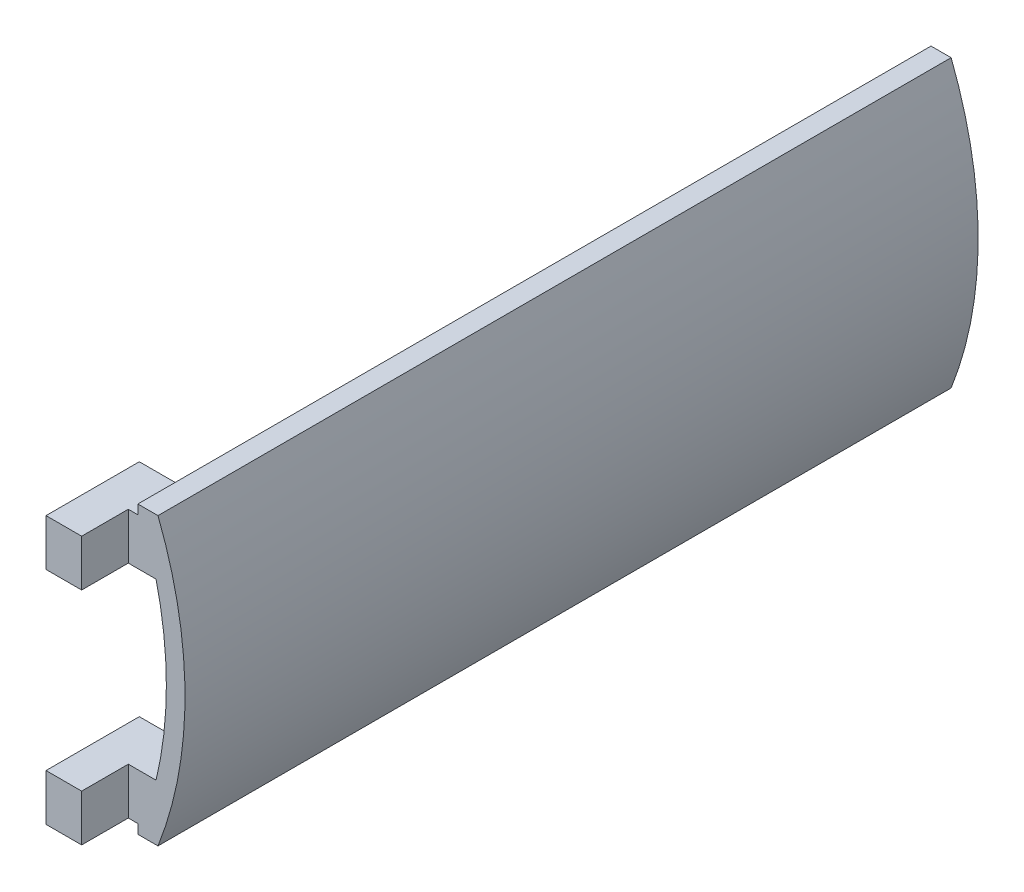
ISO-10303-21;
HEADER;
FILE_DESCRIPTION(('STEP AP214'),'2;1');
FILE_NAME('part.step','',(''),(''),'','','');
FILE_SCHEMA(('AUTOMOTIVE_DESIGN { 1 0 10303 214 1 1 1 1 }'));
ENDSEC;
DATA;
#1=APPLICATION_CONTEXT('core data for automotive mechanical design processes');
#2=APPLICATION_PROTOCOL_DEFINITION('international standard','automotive_design',2000,#1);
#3=PRODUCT_CONTEXT('',#1,'mechanical');
#4=PRODUCT('Part','Part','',(#3));
#5=PRODUCT_RELATED_PRODUCT_CATEGORY('part','',(#4));
#6=PRODUCT_DEFINITION_FORMATION('','',#4);
#7=PRODUCT_DEFINITION_CONTEXT('part definition',#1,'design');
#8=PRODUCT_DEFINITION('design','',#6,#7);
#9=PRODUCT_DEFINITION_SHAPE('','',#8);
#10=(LENGTH_UNIT() NAMED_UNIT(*) SI_UNIT(.MILLI.,.METRE.));
#11=(NAMED_UNIT(*) PLANE_ANGLE_UNIT() SI_UNIT($,.RADIAN.));
#12=(NAMED_UNIT(*) SI_UNIT($,.STERADIAN.) SOLID_ANGLE_UNIT());
#13=UNCERTAINTY_MEASURE_WITH_UNIT(LENGTH_MEASURE(1.E-05),#10,'distance_accuracy_value','');
#14=(GEOMETRIC_REPRESENTATION_CONTEXT(3) GLOBAL_UNCERTAINTY_ASSIGNED_CONTEXT((#13)) GLOBAL_UNIT_ASSIGNED_CONTEXT((#10,
#11,#12)) REPRESENTATION_CONTEXT('',''));
#15=CARTESIAN_POINT('',(0.,0.,0.));
#16=DIRECTION('',(0.,0.,1.));
#17=DIRECTION('',(1.,0.,0.));
#18=AXIS2_PLACEMENT_3D('',#15,#16,#17);
#19=CARTESIAN_POINT('',(0.,0.,85.));
#20=DIRECTION('',(0.,0.,1.));
#21=DIRECTION('',(1.,0.,0.));
#22=AXIS2_PLACEMENT_3D('',#19,#20,#21);
#23=PLANE('',#22);
#24=DIRECTION('',(-1.,0.,0.));
#25=VECTOR('',#24,1.);
#26=CARTESIAN_POINT('',(38.8967416970991,-9.32970982127268,85.));
#27=LINE('',#26,#25);
#28=CARTESIAN_POINT('',(38.8967416970991,-9.32970982127269,85.));
#29=VERTEX_POINT('',#28);
#30=CARTESIAN_POINT('',(35.9228767379871,-9.32970982127269,85.));
#31=VERTEX_POINT('',#30);
#32=EDGE_CURVE('E50',#29,#31,#27,.T.);
#33=ORIENTED_EDGE('',*,*,#32,.T.);
#34=DIRECTION('',(0.,1.,0.));
#35=VECTOR('',#34,1.);
#36=CARTESIAN_POINT('',(35.9228767379871,-9.32970982127269,85.));
#37=LINE('',#36,#35);
#38=CARTESIAN_POINT('',(35.9228767379871,-14.3297098212727,85.));
#39=VERTEX_POINT('',#38);
#40=EDGE_CURVE('E182',#39,#31,#37,.T.);
#41=ORIENTED_EDGE('',*,*,#40,.F.);
#42=DIRECTION('',(1.,0.,0.));
#43=VECTOR('',#42,1.);
#44=CARTESIAN_POINT('',(32.1024295510596,-14.3297098212727,85.));
#45=LINE('',#44,#43);
#46=CARTESIAN_POINT('',(36.9459063604559,-14.3297098212727,85.));
#47=VERTEX_POINT('',#46);
#48=EDGE_CURVE('E192',#39,#47,#45,.T.);
#49=ORIENTED_EDGE('',*,*,#48,.T.);
#50=DIRECTION('',(0.,-1.,0.));
#51=VECTOR('',#50,1.);
#52=CARTESIAN_POINT('',(36.9459063604559,-14.3297098212727,85.));
#53=LINE('',#52,#51);
#54=CARTESIAN_POINT('',(36.9459063604559,-15.3297098212727,85.));
#55=VERTEX_POINT('',#54);
#56=EDGE_CURVE('E203',#47,#55,#53,.T.);
#57=ORIENTED_EDGE('',*,*,#56,.T.);
#58=DIRECTION('',(-1.,0.,0.));
#59=VECTOR('',#58,1.);
#60=CARTESIAN_POINT('',(39.1024295510596,-15.3297098212727,85.));
#61=LINE('',#60,#59);
#62=CARTESIAN_POINT('',(39.1024295510596,-15.3297098212727,85.));
#63=VERTEX_POINT('',#62);
#64=EDGE_CURVE('E278',#63,#55,#61,.T.);
#65=ORIENTED_EDGE('',*,*,#64,.F.);
#66=CARTESIAN_POINT('',(0.,0.,85.));
#67=DIRECTION('',(0.,0.,-1.));
#68=DIRECTION('',(-1.,0.,0.));
#69=AXIS2_PLACEMENT_3D('',#66,#67,#68);
#70=CIRCLE('',#69,42.);
#71=CARTESIAN_POINT('',(39.1024295510596,15.3297098212727,85.));
#72=VERTEX_POINT('',#71);
#73=EDGE_CURVE('E275',#72,#63,#70,.T.);
#74=ORIENTED_EDGE('',*,*,#73,.F.);
#75=DIRECTION('',(1.,0.,0.));
#76=VECTOR('',#75,1.);
#77=CARTESIAN_POINT('',(36.9459063604559,15.3297098212727,85.));
#78=LINE('',#77,#76);
#79=CARTESIAN_POINT('',(36.9459063604559,15.3297098212727,85.));
#80=VERTEX_POINT('',#79);
#81=EDGE_CURVE('E271',#80,#72,#78,.T.);
#82=ORIENTED_EDGE('',*,*,#81,.F.);
#83=DIRECTION('',(0.,-1.,0.));
#84=VECTOR('',#83,1.);
#85=CARTESIAN_POINT('',(36.9459063604559,15.3297098212727,85.));
#86=LINE('',#85,#84);
#87=CARTESIAN_POINT('',(36.9459063604559,14.3297098212727,85.));
#88=VERTEX_POINT('',#87);
#89=EDGE_CURVE('E241',#80,#88,#86,.T.);
#90=ORIENTED_EDGE('',*,*,#89,.T.);
#91=DIRECTION('',(-1.,0.,0.));
#92=VECTOR('',#91,1.);
#93=CARTESIAN_POINT('',(36.9459063604559,14.3297098212727,85.));
#94=LINE('',#93,#92);
#95=CARTESIAN_POINT('',(35.9228767379871,14.3297098212727,85.));
#96=VERTEX_POINT('',#95);
#97=EDGE_CURVE('E246',#88,#96,#94,.T.);
#98=ORIENTED_EDGE('',*,*,#97,.T.);
#99=DIRECTION('',(0.,1.,0.));
#100=VECTOR('',#99,1.);
#101=CARTESIAN_POINT('',(35.9228767379871,14.3297098212727,85.));
#102=LINE('',#101,#100);
#103=CARTESIAN_POINT('',(35.9228767379871,9.32970982127266,85.));
#104=VERTEX_POINT('',#103);
#105=EDGE_CURVE('E209',#104,#96,#102,.T.);
#106=ORIENTED_EDGE('',*,*,#105,.F.);
#107=DIRECTION('',(1.,0.,0.));
#108=VECTOR('',#107,1.);
#109=CARTESIAN_POINT('',(32.1024295510596,9.32970982127266,85.));
#110=LINE('',#109,#108);
#111=CARTESIAN_POINT('',(38.8967416970991,9.32970982127267,85.));
#112=VERTEX_POINT('',#111);
#113=EDGE_CURVE('E249',#104,#112,#110,.T.);
#114=ORIENTED_EDGE('',*,*,#113,.T.);
#115=CARTESIAN_POINT('',(0.,0.,85.));
#116=DIRECTION('',(0.,0.,1.));
#117=DIRECTION('',(1.,0.,0.));
#118=AXIS2_PLACEMENT_3D('',#115,#116,#117);
#119=CIRCLE('',#118,40.);
#120=EDGE_CURVE('E269',#29,#112,#119,.T.);
#121=ORIENTED_EDGE('',*,*,#120,.F.);
#122=EDGE_LOOP('',(#33,#41,#49,#57,#65,#74,#82,#90,#98,#106,#114,#121));
#123=FACE_BOUND('',#122,.T.);
#124=ADVANCED_FACE('F33',(#123),#23,.T.);
#125=CARTESIAN_POINT('',(0.,0.,85.));
#126=DIRECTION('',(0.,0.,-1.));
#127=DIRECTION('',(-1.,0.,0.));
#128=AXIS2_PLACEMENT_3D('',#125,#126,#127);
#129=CYLINDRICAL_SURFACE('',#128,40.);
#130=DIRECTION('',(0.,0.,1.));
#131=VECTOR('',#130,1.);
#132=CARTESIAN_POINT('',(38.8967416970991,-9.32970982127269,80.));
#133=LINE('',#132,#131);
#134=CARTESIAN_POINT('',(38.8967416970991,-9.32970982127268,80.));
#135=VERTEX_POINT('',#134);
#136=EDGE_CURVE('E210',#135,#29,#133,.T.);
#137=ORIENTED_EDGE('',*,*,#136,.T.);
#138=ORIENTED_EDGE('',*,*,#120,.T.);
#139=DIRECTION('',(0.,0.,1.));
#140=VECTOR('',#139,1.);
#141=CARTESIAN_POINT('',(38.8967416970991,9.32970982127267,80.));
#142=LINE('',#141,#140);
#143=CARTESIAN_POINT('',(38.8967416970991,9.32970982127267,80.));
#144=VERTEX_POINT('',#143);
#145=EDGE_CURVE('E258',#144,#112,#142,.T.);
#146=ORIENTED_EDGE('',*,*,#145,.F.);
#147=CARTESIAN_POINT('',(0.,0.,80.));
#148=DIRECTION('',(0.,0.,1.));
#149=DIRECTION('',(1.,0.,0.));
#150=AXIS2_PLACEMENT_3D('',#147,#148,#149);
#151=CIRCLE('',#150,40.);
#152=CARTESIAN_POINT('',(36.9459063604559,15.3297098212727,80.));
#153=VERTEX_POINT('',#152);
#154=EDGE_CURVE('E228',#144,#153,#151,.T.);
#155=ORIENTED_EDGE('',*,*,#154,.T.);
#156=DIRECTION('',(0.,0.,-1.));
#157=VECTOR('',#156,1.);
#158=CARTESIAN_POINT('',(36.9459063604559,15.3297098212727,85.));
#159=LINE('',#158,#157);
#160=CARTESIAN_POINT('',(36.9459063604559,15.3297098212727,0.));
#161=VERTEX_POINT('',#160);
#162=EDGE_CURVE('E280',#153,#161,#159,.T.);
#163=ORIENTED_EDGE('',*,*,#162,.T.);
#164=CARTESIAN_POINT('',(0.,0.,0.));
#165=DIRECTION('',(0.,0.,1.));
#166=DIRECTION('',(1.,0.,0.));
#167=AXIS2_PLACEMENT_3D('',#164,#165,#166);
#168=CIRCLE('',#167,40.);
#169=CARTESIAN_POINT('',(36.9459063604559,-15.3297098212727,0.));
#170=VERTEX_POINT('',#169);
#171=EDGE_CURVE('E261',#170,#161,#168,.T.);
#172=ORIENTED_EDGE('',*,*,#171,.F.);
#173=DIRECTION('',(0.,0.,-1.));
#174=VECTOR('',#173,1.);
#175=CARTESIAN_POINT('',(36.9459063604559,-15.3297098212727,85.));
#176=LINE('',#175,#174);
#177=CARTESIAN_POINT('',(36.9459063604559,-15.3297098212727,80.));
#178=VERTEX_POINT('',#177);
#179=EDGE_CURVE('E42',#178,#170,#176,.T.);
#180=ORIENTED_EDGE('',*,*,#179,.F.);
#181=CARTESIAN_POINT('',(0.,0.,80.));
#182=DIRECTION('',(0.,0.,1.));
#183=DIRECTION('',(1.,0.,0.));
#184=AXIS2_PLACEMENT_3D('',#181,#182,#183);
#185=CIRCLE('',#184,40.);
#186=EDGE_CURVE('E58',#178,#135,#185,.T.);
#187=ORIENTED_EDGE('',*,*,#186,.T.);
#188=EDGE_LOOP('',(#137,#138,#146,#155,#163,#172,#180,#187));
#189=FACE_BOUND('',#188,.T.);
#190=ADVANCED_FACE('F35',(#189),#129,.F.);
#191=CARTESIAN_POINT('',(39.1024295510596,-15.3297098212727,85.));
#192=DIRECTION('',(0.,-1.,0.));
#193=DIRECTION('',(1.,0.,0.));
#194=AXIS2_PLACEMENT_3D('',#191,#192,#193);
#195=PLANE('',#194);
#196=DIRECTION('',(-1.,0.,0.));
#197=VECTOR('',#196,1.);
#198=CARTESIAN_POINT('',(39.1024295510596,-15.3297098212727,0.));
#199=LINE('',#198,#197);
#200=CARTESIAN_POINT('',(39.1024295510596,-15.3297098212727,0.));
#201=VERTEX_POINT('',#200);
#202=EDGE_CURVE('E272',#201,#170,#199,.T.);
#203=ORIENTED_EDGE('',*,*,#202,.F.);
#204=DIRECTION('',(0.,0.,-1.));
#205=VECTOR('',#204,1.);
#206=CARTESIAN_POINT('',(39.1024295510596,-15.3297098212727,85.));
#207=LINE('',#206,#205);
#208=EDGE_CURVE('E291',#63,#201,#207,.T.);
#209=ORIENTED_EDGE('',*,*,#208,.F.);
#210=ORIENTED_EDGE('',*,*,#64,.T.);
#211=EDGE_CURVE('E11',#55,#178,#176,.T.);
#212=ORIENTED_EDGE('',*,*,#211,.T.);
#213=ORIENTED_EDGE('',*,*,#179,.T.);
#214=EDGE_LOOP('',(#203,#209,#210,#212,#213));
#215=FACE_BOUND('',#214,.T.);
#216=ADVANCED_FACE('F312',(#215),#195,.T.);
#217=CARTESIAN_POINT('',(0.,0.,85.));
#218=DIRECTION('',(0.,0.,-1.));
#219=DIRECTION('',(-1.,0.,0.));
#220=AXIS2_PLACEMENT_3D('',#217,#218,#219);
#221=CYLINDRICAL_SURFACE('',#220,42.);
#222=CARTESIAN_POINT('',(0.,0.,0.));
#223=DIRECTION('',(0.,0.,-1.));
#224=DIRECTION('',(-1.,0.,0.));
#225=AXIS2_PLACEMENT_3D('',#222,#223,#224);
#226=CIRCLE('',#225,42.);
#227=CARTESIAN_POINT('',(39.1024295510596,15.3297098212727,0.));
#228=VERTEX_POINT('',#227);
#229=EDGE_CURVE('E286',#228,#201,#226,.T.);
#230=ORIENTED_EDGE('',*,*,#229,.F.);
#231=DIRECTION('',(0.,0.,-1.));
#232=VECTOR('',#231,1.);
#233=CARTESIAN_POINT('',(39.1024295510596,15.3297098212727,85.));
#234=LINE('',#233,#232);
#235=EDGE_CURVE('E293',#72,#228,#234,.T.);
#236=ORIENTED_EDGE('',*,*,#235,.F.);
#237=ORIENTED_EDGE('',*,*,#73,.T.);
#238=ORIENTED_EDGE('',*,*,#208,.T.);
#239=EDGE_LOOP('',(#230,#236,#237,#238));
#240=FACE_BOUND('',#239,.T.);
#241=ADVANCED_FACE('F346',(#240),#221,.T.);
#242=CARTESIAN_POINT('',(36.9459063604559,15.3297098212727,85.));
#243=DIRECTION('',(0.,1.,0.));
#244=DIRECTION('',(-1.,0.,0.));
#245=AXIS2_PLACEMENT_3D('',#242,#243,#244);
#246=PLANE('',#245);
#247=DIRECTION('',(1.,0.,0.));
#248=VECTOR('',#247,1.);
#249=CARTESIAN_POINT('',(36.9459063604559,15.3297098212727,0.));
#250=LINE('',#249,#248);
#251=EDGE_CURVE('E283',#161,#228,#250,.T.);
#252=ORIENTED_EDGE('',*,*,#251,.F.);
#253=ORIENTED_EDGE('',*,*,#162,.F.);
#254=EDGE_CURVE('E294',#80,#153,#159,.T.);
#255=ORIENTED_EDGE('',*,*,#254,.F.);
#256=ORIENTED_EDGE('',*,*,#81,.T.);
#257=ORIENTED_EDGE('',*,*,#235,.T.);
#258=EDGE_LOOP('',(#252,#253,#255,#256,#257));
#259=FACE_BOUND('',#258,.T.);
#260=ADVANCED_FACE('F306',(#259),#246,.T.);
#261=CARTESIAN_POINT('',(0.,0.,0.));
#262=DIRECTION('',(0.,0.,1.));
#263=DIRECTION('',(1.,0.,0.));
#264=AXIS2_PLACEMENT_3D('',#261,#262,#263);
#265=PLANE('',#264);
#266=ORIENTED_EDGE('',*,*,#171,.T.);
#267=ORIENTED_EDGE('',*,*,#251,.T.);
#268=ORIENTED_EDGE('',*,*,#229,.T.);
#269=ORIENTED_EDGE('',*,*,#202,.T.);
#270=EDGE_LOOP('',(#266,#267,#268,#269));
#271=FACE_BOUND('',#270,.T.);
#272=ADVANCED_FACE('F309',(#271),#265,.F.);
#273=CARTESIAN_POINT('',(32.1024295510596,9.32970982127266,80.));
#274=DIRECTION('',(0.,-1.,0.));
#275=DIRECTION('',(1.,0.,0.));
#276=AXIS2_PLACEMENT_3D('',#273,#274,#275);
#277=PLANE('',#276);
#278=ORIENTED_EDGE('',*,*,#113,.F.);
#279=DIRECTION('',(0.,0.,-1.));
#280=VECTOR('',#279,1.);
#281=CARTESIAN_POINT('',(35.9228767379871,9.32970982127266,90.));
#282=LINE('',#281,#280);
#283=CARTESIAN_POINT('',(35.9228767379871,9.32970982127266,90.));
#284=VERTEX_POINT('',#283);
#285=EDGE_CURVE('E225',#284,#104,#282,.T.);
#286=ORIENTED_EDGE('',*,*,#285,.F.);
#287=DIRECTION('',(1.,0.,0.));
#288=VECTOR('',#287,1.);
#289=CARTESIAN_POINT('',(35.9228767379871,9.32970982127266,90.));
#290=LINE('',#289,#288);
#291=CARTESIAN_POINT('',(32.1024295510596,9.32970982127266,90.));
#292=VERTEX_POINT('',#291);
#293=EDGE_CURVE('E223',#292,#284,#290,.T.);
#294=ORIENTED_EDGE('',*,*,#293,.F.);
#295=DIRECTION('',(0.,0.,1.));
#296=VECTOR('',#295,1.);
#297=CARTESIAN_POINT('',(32.1024295510596,9.32970982127266,80.));
#298=LINE('',#297,#296);
#299=CARTESIAN_POINT('',(32.1024295510596,9.32970982127266,80.));
#300=VERTEX_POINT('',#299);
#301=EDGE_CURVE('E262',#300,#292,#298,.T.);
#302=ORIENTED_EDGE('',*,*,#301,.F.);
#303=DIRECTION('',(1.,0.,0.));
#304=VECTOR('',#303,1.);
#305=CARTESIAN_POINT('',(32.1024295510596,9.32970982127266,80.));
#306=LINE('',#305,#304);
#307=EDGE_CURVE('E268',#300,#144,#306,.T.);
#308=ORIENTED_EDGE('',*,*,#307,.T.);
#309=ORIENTED_EDGE('',*,*,#145,.T.);
#310=EDGE_LOOP('',(#278,#286,#294,#302,#308,#309));
#311=FACE_BOUND('',#310,.T.);
#312=ADVANCED_FACE('F327',(#311),#277,.T.);
#313=CARTESIAN_POINT('',(32.1024295510596,14.3297098212727,80.));
#314=DIRECTION('',(-1.,0.,0.));
#315=DIRECTION('',(0.,0.,1.));
#316=AXIS2_PLACEMENT_3D('',#313,#314,#315);
#317=PLANE('',#316);
#318=ORIENTED_EDGE('',*,*,#301,.T.);
#319=DIRECTION('',(0.,-1.,0.));
#320=VECTOR('',#319,1.);
#321=CARTESIAN_POINT('',(32.1024295510596,9.32970982127266,90.));
#322=LINE('',#321,#320);
#323=CARTESIAN_POINT('',(32.1024295510596,14.3297098212727,90.));
#324=VERTEX_POINT('',#323);
#325=EDGE_CURVE('E220',#324,#292,#322,.T.);
#326=ORIENTED_EDGE('',*,*,#325,.F.);
#327=DIRECTION('',(0.,0.,1.));
#328=VECTOR('',#327,1.);
#329=CARTESIAN_POINT('',(32.1024295510596,14.3297098212727,80.));
#330=LINE('',#329,#328);
#331=CARTESIAN_POINT('',(32.1024295510596,14.3297098212727,80.));
#332=VERTEX_POINT('',#331);
#333=EDGE_CURVE('E264',#332,#324,#330,.T.);
#334=ORIENTED_EDGE('',*,*,#333,.F.);
#335=DIRECTION('',(0.,-1.,0.));
#336=VECTOR('',#335,1.);
#337=CARTESIAN_POINT('',(32.1024295510596,14.3297098212727,80.));
#338=LINE('',#337,#336);
#339=EDGE_CURVE('E333',#332,#300,#338,.T.);
#340=ORIENTED_EDGE('',*,*,#339,.T.);
#341=EDGE_LOOP('',(#318,#326,#334,#340));
#342=FACE_BOUND('',#341,.T.);
#343=ADVANCED_FACE('F366',(#342),#317,.T.);
#344=CARTESIAN_POINT('',(36.9459063604559,14.3297098212727,80.));
#345=DIRECTION('',(0.,1.,0.));
#346=DIRECTION('',(0.,0.,1.));
#347=AXIS2_PLACEMENT_3D('',#344,#345,#346);
#348=PLANE('',#347);
#349=ORIENTED_EDGE('',*,*,#97,.F.);
#350=DIRECTION('',(0.,0.,1.));
#351=VECTOR('',#350,1.);
#352=CARTESIAN_POINT('',(36.9459063604559,14.3297098212727,80.));
#353=LINE('',#352,#351);
#354=CARTESIAN_POINT('',(36.9459063604559,14.3297098212727,80.));
#355=VERTEX_POINT('',#354);
#356=EDGE_CURVE('E266',#355,#88,#353,.T.);
#357=ORIENTED_EDGE('',*,*,#356,.F.);
#358=DIRECTION('',(-1.,0.,0.));
#359=VECTOR('',#358,1.);
#360=CARTESIAN_POINT('',(36.9459063604559,14.3297098212727,80.));
#361=LINE('',#360,#359);
#362=EDGE_CURVE('E335',#355,#332,#361,.T.);
#363=ORIENTED_EDGE('',*,*,#362,.T.);
#364=ORIENTED_EDGE('',*,*,#333,.T.);
#365=DIRECTION('',(-1.,0.,0.));
#366=VECTOR('',#365,1.);
#367=CARTESIAN_POINT('',(32.1024295510596,14.3297098212727,90.));
#368=LINE('',#367,#366);
#369=CARTESIAN_POINT('',(35.9228767379871,14.3297098212727,90.));
#370=VERTEX_POINT('',#369);
#371=EDGE_CURVE('E217',#370,#324,#368,.T.);
#372=ORIENTED_EDGE('',*,*,#371,.F.);
#373=DIRECTION('',(0.,0.,-1.));
#374=VECTOR('',#373,1.);
#375=CARTESIAN_POINT('',(35.9228767379871,14.3297098212727,90.));
#376=LINE('',#375,#374);
#377=EDGE_CURVE('E236',#370,#96,#376,.T.);
#378=ORIENTED_EDGE('',*,*,#377,.T.);
#379=EDGE_LOOP('',(#349,#357,#363,#364,#372,#378));
#380=FACE_BOUND('',#379,.T.);
#381=ADVANCED_FACE('F343',(#380),#348,.T.);
#382=CARTESIAN_POINT('',(36.9459063604559,15.3297098212727,80.));
#383=DIRECTION('',(-1.,0.,0.));
#384=DIRECTION('',(0.,0.,1.));
#385=AXIS2_PLACEMENT_3D('',#382,#383,#384);
#386=PLANE('',#385);
#387=ORIENTED_EDGE('',*,*,#89,.F.);
#388=ORIENTED_EDGE('',*,*,#254,.T.);
#389=DIRECTION('',(0.,-1.,0.));
#390=VECTOR('',#389,1.);
#391=CARTESIAN_POINT('',(36.9459063604559,15.3297098212727,80.));
#392=LINE('',#391,#390);
#393=EDGE_CURVE('E339',#153,#355,#392,.T.);
#394=ORIENTED_EDGE('',*,*,#393,.T.);
#395=ORIENTED_EDGE('',*,*,#356,.T.);
#396=EDGE_LOOP('',(#387,#388,#394,#395));
#397=FACE_BOUND('',#396,.T.);
#398=ADVANCED_FACE('F340',(#397),#386,.T.);
#399=CARTESIAN_POINT('',(0.,0.,80.));
#400=DIRECTION('',(0.,0.,1.));
#401=DIRECTION('',(1.,0.,0.));
#402=AXIS2_PLACEMENT_3D('',#399,#400,#401);
#403=PLANE('',#402);
#404=ORIENTED_EDGE('',*,*,#154,.F.);
#405=ORIENTED_EDGE('',*,*,#307,.F.);
#406=ORIENTED_EDGE('',*,*,#339,.F.);
#407=ORIENTED_EDGE('',*,*,#362,.F.);
#408=ORIENTED_EDGE('',*,*,#393,.F.);
#409=EDGE_LOOP('',(#404,#405,#406,#407,#408));
#410=FACE_BOUND('',#409,.T.);
#411=ADVANCED_FACE('F342',(#410),#403,.F.);
#412=CARTESIAN_POINT('',(35.9228767379871,14.3297098212727,90.));
#413=DIRECTION('',(-1.,0.,0.));
#414=DIRECTION('',(0.,0.,1.));
#415=AXIS2_PLACEMENT_3D('',#412,#413,#414);
#416=PLANE('',#415);
#417=ORIENTED_EDGE('',*,*,#105,.T.);
#418=ORIENTED_EDGE('',*,*,#377,.F.);
#419=DIRECTION('',(0.,1.,0.));
#420=VECTOR('',#419,1.);
#421=CARTESIAN_POINT('',(35.9228767379871,14.3297098212727,90.));
#422=LINE('',#421,#420);
#423=EDGE_CURVE('E214',#284,#370,#422,.T.);
#424=ORIENTED_EDGE('',*,*,#423,.F.);
#425=ORIENTED_EDGE('',*,*,#285,.T.);
#426=EDGE_LOOP('',(#417,#418,#424,#425));
#427=FACE_BOUND('',#426,.T.);
#428=ADVANCED_FACE('F382',(#427),#416,.F.);
#429=CARTESIAN_POINT('',(0.,0.,90.));
#430=DIRECTION('',(0.,0.,-1.));
#431=DIRECTION('',(-1.,0.,0.));
#432=AXIS2_PLACEMENT_3D('',#429,#430,#431);
#433=PLANE('',#432);
#434=ORIENTED_EDGE('',*,*,#423,.T.);
#435=ORIENTED_EDGE('',*,*,#371,.T.);
#436=ORIENTED_EDGE('',*,*,#325,.T.);
#437=ORIENTED_EDGE('',*,*,#293,.T.);
#438=EDGE_LOOP('',(#434,#435,#436,#437));
#439=FACE_BOUND('',#438,.T.);
#440=ADVANCED_FACE('F386',(#439),#433,.F.);
#441=CARTESIAN_POINT('',(32.1024295510596,-9.3297098212727,80.));
#442=DIRECTION('',(-1.,0.,0.));
#443=DIRECTION('',(0.,0.,1.));
#444=AXIS2_PLACEMENT_3D('',#441,#442,#443);
#445=PLANE('',#444);
#446=DIRECTION('',(0.,0.,1.));
#447=VECTOR('',#446,1.);
#448=CARTESIAN_POINT('',(32.1024295510596,-14.3297098212727,80.));
#449=LINE('',#448,#447);
#450=CARTESIAN_POINT('',(32.1024295510596,-14.3297098212727,80.));
#451=VERTEX_POINT('',#450);
#452=CARTESIAN_POINT('',(32.1024295510596,-14.3297098212727,90.));
#453=VERTEX_POINT('',#452);
#454=EDGE_CURVE('E156',#451,#453,#449,.T.);
#455=ORIENTED_EDGE('',*,*,#454,.T.);
#456=DIRECTION('',(0.,-1.,0.));
#457=VECTOR('',#456,1.);
#458=CARTESIAN_POINT('',(32.1024295510596,-14.3297098212727,90.));
#459=LINE('',#458,#457);
#460=CARTESIAN_POINT('',(32.1024295510596,-9.3297098212727,90.));
#461=VERTEX_POINT('',#460);
#462=EDGE_CURVE('E160',#461,#453,#459,.T.);
#463=ORIENTED_EDGE('',*,*,#462,.F.);
#464=DIRECTION('',(0.,0.,1.));
#465=VECTOR('',#464,1.);
#466=CARTESIAN_POINT('',(32.1024295510596,-9.3297098212727,80.));
#467=LINE('',#466,#465);
#468=CARTESIAN_POINT('',(32.1024295510596,-9.3297098212727,80.));
#469=VERTEX_POINT('',#468);
#470=EDGE_CURVE('E207',#469,#461,#467,.T.);
#471=ORIENTED_EDGE('',*,*,#470,.F.);
#472=DIRECTION('',(0.,-1.,0.));
#473=VECTOR('',#472,1.);
#474=CARTESIAN_POINT('',(32.1024295510596,-9.3297098212727,80.));
#475=LINE('',#474,#473);
#476=EDGE_CURVE('E162',#469,#451,#475,.T.);
#477=ORIENTED_EDGE('',*,*,#476,.T.);
#478=EDGE_LOOP('',(#455,#463,#471,#477));
#479=FACE_BOUND('',#478,.T.);
#480=ADVANCED_FACE('F158',(#479),#445,.T.);
#481=CARTESIAN_POINT('',(38.8967416970991,-9.32970982127268,80.));
#482=DIRECTION('',(0.,1.,0.));
#483=DIRECTION('',(-1.,0.,0.));
#484=AXIS2_PLACEMENT_3D('',#481,#482,#483);
#485=PLANE('',#484);
#486=ORIENTED_EDGE('',*,*,#32,.F.);
#487=ORIENTED_EDGE('',*,*,#136,.F.);
#488=DIRECTION('',(-1.,0.,0.));
#489=VECTOR('',#488,1.);
#490=CARTESIAN_POINT('',(38.8967416970991,-9.32970982127268,80.));
#491=LINE('',#490,#489);
#492=EDGE_CURVE('E167',#135,#469,#491,.T.);
#493=ORIENTED_EDGE('',*,*,#492,.T.);
#494=ORIENTED_EDGE('',*,*,#470,.T.);
#495=DIRECTION('',(-1.,0.,0.));
#496=VECTOR('',#495,1.);
#497=CARTESIAN_POINT('',(32.1024295510596,-9.3297098212727,90.));
#498=LINE('',#497,#496);
#499=CARTESIAN_POINT('',(35.9228767379871,-9.32970982127269,90.));
#500=VERTEX_POINT('',#499);
#501=EDGE_CURVE('E181',#500,#461,#498,.T.);
#502=ORIENTED_EDGE('',*,*,#501,.F.);
#503=DIRECTION('',(0.,0.,-1.));
#504=VECTOR('',#503,1.);
#505=CARTESIAN_POINT('',(35.9228767379871,-9.32970982127269,90.));
#506=LINE('',#505,#504);
#507=EDGE_CURVE('E187',#500,#31,#506,.T.);
#508=ORIENTED_EDGE('',*,*,#507,.T.);
#509=EDGE_LOOP('',(#486,#487,#493,#494,#502,#508));
#510=FACE_BOUND('',#509,.T.);
#511=ADVANCED_FACE('F323',(#510),#485,.T.);
#512=CARTESIAN_POINT('',(36.9459063604559,-14.3297098212727,80.));
#513=DIRECTION('',(-1.,0.,0.));
#514=DIRECTION('',(0.,0.,1.));
#515=AXIS2_PLACEMENT_3D('',#512,#513,#514);
#516=PLANE('',#515);
#517=ORIENTED_EDGE('',*,*,#56,.F.);
#518=DIRECTION('',(0.,0.,1.));
#519=VECTOR('',#518,1.);
#520=CARTESIAN_POINT('',(36.9459063604559,-14.3297098212727,80.));
#521=LINE('',#520,#519);
#522=CARTESIAN_POINT('',(36.9459063604559,-14.3297098212727,80.));
#523=VERTEX_POINT('',#522);
#524=EDGE_CURVE('E166',#523,#47,#521,.T.);
#525=ORIENTED_EDGE('',*,*,#524,.F.);
#526=DIRECTION('',(0.,-1.,0.));
#527=VECTOR('',#526,1.);
#528=CARTESIAN_POINT('',(36.9459063604559,-14.3297098212727,80.));
#529=LINE('',#528,#527);
#530=EDGE_CURVE('E196',#523,#178,#529,.T.);
#531=ORIENTED_EDGE('',*,*,#530,.T.);
#532=ORIENTED_EDGE('',*,*,#211,.F.);
#533=EDGE_LOOP('',(#517,#525,#531,#532));
#534=FACE_BOUND('',#533,.T.);
#535=ADVANCED_FACE('F321',(#534),#516,.T.);
#536=CARTESIAN_POINT('',(32.1024295510596,-14.3297098212727,80.));
#537=DIRECTION('',(0.,-1.,0.));
#538=DIRECTION('',(0.,0.,-1.));
#539=AXIS2_PLACEMENT_3D('',#536,#537,#538);
#540=PLANE('',#539);
#541=ORIENTED_EDGE('',*,*,#48,.F.);
#542=DIRECTION('',(0.,0.,-1.));
#543=VECTOR('',#542,1.);
#544=CARTESIAN_POINT('',(35.9228767379871,-14.3297098212727,90.));
#545=LINE('',#544,#543);
#546=CARTESIAN_POINT('',(35.9228767379871,-14.3297098212727,90.));
#547=VERTEX_POINT('',#546);
#548=EDGE_CURVE('E173',#547,#39,#545,.T.);
#549=ORIENTED_EDGE('',*,*,#548,.F.);
#550=DIRECTION('',(1.,0.,0.));
#551=VECTOR('',#550,1.);
#552=CARTESIAN_POINT('',(35.9228767379871,-14.3297098212727,90.));
#553=LINE('',#552,#551);
#554=EDGE_CURVE('E170',#453,#547,#553,.T.);
#555=ORIENTED_EDGE('',*,*,#554,.F.);
#556=ORIENTED_EDGE('',*,*,#454,.F.);
#557=DIRECTION('',(1.,0.,0.));
#558=VECTOR('',#557,1.);
#559=CARTESIAN_POINT('',(32.1024295510596,-14.3297098212727,80.));
#560=LINE('',#559,#558);
#561=EDGE_CURVE('E194',#451,#523,#560,.T.);
#562=ORIENTED_EDGE('',*,*,#561,.T.);
#563=ORIENTED_EDGE('',*,*,#524,.T.);
#564=EDGE_LOOP('',(#541,#549,#555,#556,#562,#563));
#565=FACE_BOUND('',#564,.T.);
#566=ADVANCED_FACE('F171',(#565),#540,.T.);
#567=CARTESIAN_POINT('',(0.,0.,80.));
#568=DIRECTION('',(0.,0.,1.));
#569=DIRECTION('',(1.,0.,0.));
#570=AXIS2_PLACEMENT_3D('',#567,#568,#569);
#571=PLANE('',#570);
#572=ORIENTED_EDGE('',*,*,#476,.F.);
#573=ORIENTED_EDGE('',*,*,#492,.F.);
#574=ORIENTED_EDGE('',*,*,#186,.F.);
#575=ORIENTED_EDGE('',*,*,#530,.F.);
#576=ORIENTED_EDGE('',*,*,#561,.F.);
#577=EDGE_LOOP('',(#572,#573,#574,#575,#576));
#578=FACE_BOUND('',#577,.T.);
#579=ADVANCED_FACE('F320',(#578),#571,.F.);
#580=CARTESIAN_POINT('',(35.9228767379871,-9.32970982127269,90.));
#581=DIRECTION('',(-1.,0.,0.));
#582=DIRECTION('',(0.,0.,1.));
#583=AXIS2_PLACEMENT_3D('',#580,#581,#582);
#584=PLANE('',#583);
#585=ORIENTED_EDGE('',*,*,#40,.T.);
#586=ORIENTED_EDGE('',*,*,#507,.F.);
#587=DIRECTION('',(0.,1.,0.));
#588=VECTOR('',#587,1.);
#589=CARTESIAN_POINT('',(35.9228767379871,-9.32970982127269,90.));
#590=LINE('',#589,#588);
#591=EDGE_CURVE('E176',#547,#500,#590,.T.);
#592=ORIENTED_EDGE('',*,*,#591,.F.);
#593=ORIENTED_EDGE('',*,*,#548,.T.);
#594=EDGE_LOOP('',(#585,#586,#592,#593));
#595=FACE_BOUND('',#594,.T.);
#596=ADVANCED_FACE('F403',(#595),#584,.F.);
#597=CARTESIAN_POINT('',(0.,0.,90.));
#598=DIRECTION('',(0.,0.,-1.));
#599=DIRECTION('',(-1.,0.,0.));
#600=AXIS2_PLACEMENT_3D('',#597,#598,#599);
#601=PLANE('',#600);
#602=ORIENTED_EDGE('',*,*,#462,.T.);
#603=ORIENTED_EDGE('',*,*,#554,.T.);
#604=ORIENTED_EDGE('',*,*,#591,.T.);
#605=ORIENTED_EDGE('',*,*,#501,.T.);
#606=EDGE_LOOP('',(#602,#603,#604,#605));
#607=FACE_BOUND('',#606,.T.);
#608=ADVANCED_FACE('F179',(#607),#601,.F.);
#609=CLOSED_SHELL('',(#124,#190,#216,#241,#260,#272,#312,#343,#381,#398,#411,#428,#440,#480,
#511,#535,#566,#579,#596,#608));
#610=MANIFOLD_SOLID_BREP('B2',#609);
#611=ADVANCED_BREP_SHAPE_REPRESENTATION('',(#18,#610),#14);
#612=SHAPE_DEFINITION_REPRESENTATION(#9,#611);
ENDSEC;
END-ISO-10303-21;
